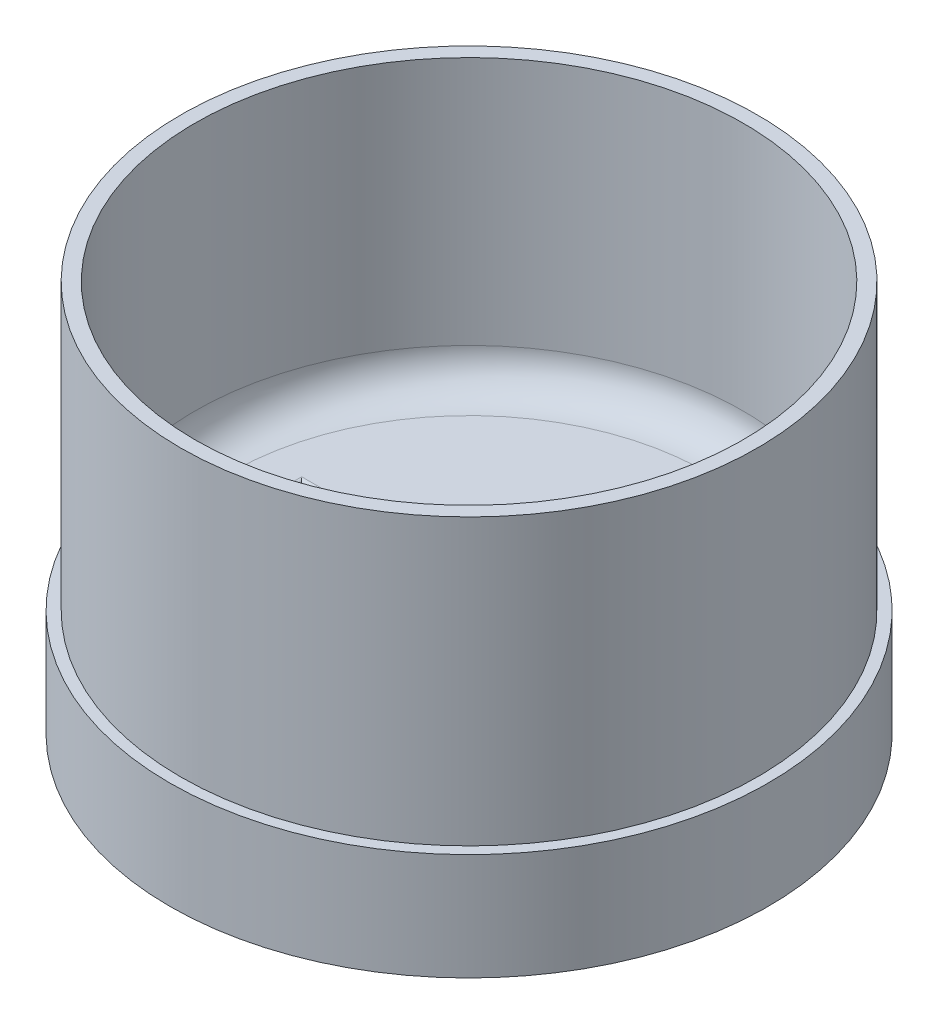
ISO-10303-21;
HEADER;
FILE_DESCRIPTION(('STEP AP214'),'2;1');
FILE_NAME('part.step','',(''),(''),'','','');
FILE_SCHEMA(('AUTOMOTIVE_DESIGN { 1 0 10303 214 1 1 1 1 }'));
ENDSEC;
DATA;
#1=APPLICATION_CONTEXT('core data for automotive mechanical design processes');
#2=APPLICATION_PROTOCOL_DEFINITION('international standard','automotive_design',2000,#1);
#3=PRODUCT_CONTEXT('',#1,'mechanical');
#4=PRODUCT('Part','Part','',(#3));
#5=PRODUCT_RELATED_PRODUCT_CATEGORY('part','',(#4));
#6=PRODUCT_DEFINITION_FORMATION('','',#4);
#7=PRODUCT_DEFINITION_CONTEXT('part definition',#1,'design');
#8=PRODUCT_DEFINITION('design','',#6,#7);
#9=PRODUCT_DEFINITION_SHAPE('','',#8);
#10=(LENGTH_UNIT() NAMED_UNIT(*) SI_UNIT(.MILLI.,.METRE.));
#11=(NAMED_UNIT(*) PLANE_ANGLE_UNIT() SI_UNIT($,.RADIAN.));
#12=(NAMED_UNIT(*) SI_UNIT($,.STERADIAN.) SOLID_ANGLE_UNIT());
#13=UNCERTAINTY_MEASURE_WITH_UNIT(LENGTH_MEASURE(1.E-05),#10,'distance_accuracy_value','');
#14=(GEOMETRIC_REPRESENTATION_CONTEXT(3) GLOBAL_UNCERTAINTY_ASSIGNED_CONTEXT((#13)) GLOBAL_UNIT_ASSIGNED_CONTEXT((#10,
#11,#12)) REPRESENTATION_CONTEXT('',''));
#15=CARTESIAN_POINT('',(0.,0.,0.));
#16=DIRECTION('',(0.,0.,1.));
#17=DIRECTION('',(1.,0.,0.));
#18=AXIS2_PLACEMENT_3D('',#15,#16,#17);
#19=CARTESIAN_POINT('',(0.,0.,0.));
#20=DIRECTION('',(0.,1.,0.));
#21=DIRECTION('',(0.,0.,1.));
#22=AXIS2_PLACEMENT_3D('',#19,#20,#21);
#23=PLANE('',#22);
#24=CARTESIAN_POINT('',(0.,0.,0.));
#25=DIRECTION('',(0.,1.,0.));
#26=DIRECTION('',(0.,0.,1.));
#27=AXIS2_PLACEMENT_3D('',#24,#25,#26);
#28=CIRCLE('',#27,84.);
#29=CARTESIAN_POINT('',(0.,0.,84.));
#30=VERTEX_POINT('',#29);
#31=EDGE_CURVE('E238',#30,#30,#28,.T.);
#32=ORIENTED_EDGE('',*,*,#31,.F.);
#33=EDGE_LOOP('',(#32));
#34=FACE_BOUND('',#33,.T.);
#35=CARTESIAN_POINT('',(0.,0.,0.));
#36=DIRECTION('',(0.,1.,0.));
#37=DIRECTION('',(0.,0.,1.));
#38=AXIS2_PLACEMENT_3D('',#35,#36,#37);
#39=CIRCLE('',#38,79.);
#40=CARTESIAN_POINT('',(0.,0.,79.));
#41=VERTEX_POINT('',#40);
#42=EDGE_CURVE('E234',#41,#41,#39,.T.);
#43=ORIENTED_EDGE('',*,*,#42,.T.);
#44=EDGE_LOOP('',(#43));
#45=FACE_BOUND('',#44,.T.);
#46=ADVANCED_FACE('F44',(#34,#45),#23,.F.);
#47=CARTESIAN_POINT('',(0.,25.,0.));
#48=DIRECTION('',(0.,-1.,0.));
#49=DIRECTION('',(0.,0.,-1.));
#50=AXIS2_PLACEMENT_3D('',#47,#48,#49);
#51=CYLINDRICAL_SURFACE('',#50,84.);
#52=ORIENTED_EDGE('',*,*,#31,.T.);
#53=EDGE_LOOP('',(#52));
#54=FACE_BOUND('',#53,.T.);
#55=CARTESIAN_POINT('',(0.,30.,0.));
#56=DIRECTION('',(0.,1.,0.));
#57=DIRECTION('',(0.,0.,1.));
#58=AXIS2_PLACEMENT_3D('',#55,#56,#57);
#59=CIRCLE('',#58,84.);
#60=CARTESIAN_POINT('',(0.,30.,84.));
#61=VERTEX_POINT('',#60);
#62=EDGE_CURVE('E227',#61,#61,#59,.T.);
#63=ORIENTED_EDGE('',*,*,#62,.F.);
#64=EDGE_LOOP('',(#63));
#65=FACE_BOUND('',#64,.T.);
#66=ADVANCED_FACE('F404',(#54,#65),#51,.T.);
#67=CARTESIAN_POINT('',(0.,25.,0.));
#68=DIRECTION('',(0.,-1.,0.));
#69=DIRECTION('',(0.,0.,-1.));
#70=AXIS2_PLACEMENT_3D('',#67,#68,#69);
#71=CYLINDRICAL_SURFACE('',#70,79.);
#72=CARTESIAN_POINT('',(0.,15.,0.));
#73=DIRECTION('',(0.,1.,0.));
#74=DIRECTION('',(0.,0.,1.));
#75=AXIS2_PLACEMENT_3D('',#72,#73,#74);
#76=CIRCLE('',#75,79.);
#77=CARTESIAN_POINT('',(0.,15.,79.));
#78=VERTEX_POINT('',#77);
#79=EDGE_CURVE('E242',#78,#78,#76,.T.);
#80=ORIENTED_EDGE('',*,*,#79,.T.);
#81=EDGE_LOOP('',(#80));
#82=FACE_BOUND('',#81,.T.);
#83=ORIENTED_EDGE('',*,*,#42,.F.);
#84=EDGE_LOOP('',(#83));
#85=FACE_BOUND('',#84,.T.);
#86=ADVANCED_FACE('F410',(#82,#85),#71,.F.);
#87=CARTESIAN_POINT('',(0.,25.,0.));
#88=DIRECTION('',(0.,1.,0.));
#89=DIRECTION('',(0.,0.,1.));
#90=AXIS2_PLACEMENT_3D('',#87,#88,#89);
#91=PLANE('',#90);
#92=DIRECTION('',(0.,0.,1.));
#93=VECTOR('',#92,1.);
#94=CARTESIAN_POINT('',(-44.,25.,0.));
#95=LINE('',#94,#93);
#96=CARTESIAN_POINT('',(-44.,25.,9.00000000000001));
#97=VERTEX_POINT('',#96);
#98=CARTESIAN_POINT('',(-44.,25.,-8.99999999999999));
#99=VERTEX_POINT('',#98);
#100=EDGE_CURVE('E293',#97,#99,#95,.F.);
#101=ORIENTED_EDGE('',*,*,#100,.T.);
#102=DIRECTION('',(1.,0.,0.));
#103=VECTOR('',#102,1.);
#104=CARTESIAN_POINT('',(0.,25.,-9.00000000000001));
#105=LINE('',#104,#103);
#106=CARTESIAN_POINT('',(-56.,25.,-8.99999999999999));
#107=VERTEX_POINT('',#106);
#108=EDGE_CURVE('E166',#99,#107,#105,.F.);
#109=ORIENTED_EDGE('',*,*,#108,.T.);
#110=DIRECTION('',(0.,0.,-1.));
#111=VECTOR('',#110,1.);
#112=CARTESIAN_POINT('',(-56.,25.,0.));
#113=LINE('',#112,#111);
#114=CARTESIAN_POINT('',(-56.,25.,9.00000000000001));
#115=VERTEX_POINT('',#114);
#116=EDGE_CURVE('E297',#107,#115,#113,.F.);
#117=ORIENTED_EDGE('',*,*,#116,.T.);
#118=DIRECTION('',(-1.,0.,0.));
#119=VECTOR('',#118,1.);
#120=CARTESIAN_POINT('',(0.,25.,9.00000000000001));
#121=LINE('',#120,#119);
#122=EDGE_CURVE('E295',#115,#97,#121,.F.);
#123=ORIENTED_EDGE('',*,*,#122,.T.);
#124=EDGE_LOOP('',(#101,#109,#117,#123));
#125=FACE_BOUND('',#124,.T.);
#126=DIRECTION('',(1.,0.,0.));
#127=VECTOR('',#126,1.);
#128=CARTESIAN_POINT('',(0.,25.,-4.5));
#129=LINE('',#128,#127);
#130=CARTESIAN_POINT('',(8.,25.,-4.5));
#131=VERTEX_POINT('',#130);
#132=CARTESIAN_POINT('',(-8.,25.,-4.5));
#133=VERTEX_POINT('',#132);
#134=EDGE_CURVE('E284',#131,#133,#129,.F.);
#135=ORIENTED_EDGE('',*,*,#134,.T.);
#136=DIRECTION('',(0.,0.,-1.));
#137=VECTOR('',#136,1.);
#138=CARTESIAN_POINT('',(-8.,25.,0.));
#139=LINE('',#138,#137);
#140=CARTESIAN_POINT('',(-8.,25.,4.5));
#141=VERTEX_POINT('',#140);
#142=EDGE_CURVE('E290',#133,#141,#139,.F.);
#143=ORIENTED_EDGE('',*,*,#142,.T.);
#144=DIRECTION('',(-1.,0.,0.));
#145=VECTOR('',#144,1.);
#146=CARTESIAN_POINT('',(0.,25.,4.5));
#147=LINE('',#146,#145);
#148=CARTESIAN_POINT('',(8.,25.,4.5));
#149=VERTEX_POINT('',#148);
#150=EDGE_CURVE('E288',#141,#149,#147,.F.);
#151=ORIENTED_EDGE('',*,*,#150,.T.);
#152=DIRECTION('',(0.,0.,1.));
#153=VECTOR('',#152,1.);
#154=CARTESIAN_POINT('',(8.,25.,0.));
#155=LINE('',#154,#153);
#156=EDGE_CURVE('E286',#149,#131,#155,.F.);
#157=ORIENTED_EDGE('',*,*,#156,.T.);
#158=EDGE_LOOP('',(#135,#143,#151,#157));
#159=FACE_BOUND('',#158,.T.);
#160=CARTESIAN_POINT('',(0.,25.,0.));
#161=DIRECTION('',(0.,1.,0.));
#162=DIRECTION('',(0.,0.,1.));
#163=AXIS2_PLACEMENT_3D('',#160,#161,#162);
#164=CIRCLE('',#163,69.);
#165=CARTESIAN_POINT('',(0.,25.,69.));
#166=VERTEX_POINT('',#165);
#167=EDGE_CURVE('E246',#166,#166,#164,.F.);
#168=ORIENTED_EDGE('',*,*,#167,.T.);
#169=EDGE_LOOP('',(#168));
#170=FACE_BOUND('',#169,.T.);
#171=ADVANCED_FACE('F401',(#125,#159,#170),#91,.F.);
#172=CARTESIAN_POINT('',(0.,30.,0.));
#173=DIRECTION('',(0.,1.,0.));
#174=DIRECTION('',(0.,0.,1.));
#175=AXIS2_PLACEMENT_3D('',#172,#173,#174);
#176=PLANE('',#175);
#177=CARTESIAN_POINT('',(0.,30.,0.));
#178=DIRECTION('',(0.,1.,0.));
#179=DIRECTION('',(0.,0.,1.));
#180=AXIS2_PLACEMENT_3D('',#177,#178,#179);
#181=CIRCLE('',#180,81.);
#182=CARTESIAN_POINT('',(0.,30.,81.));
#183=VERTEX_POINT('',#182);
#184=EDGE_CURVE('E222',#183,#183,#181,.T.);
#185=ORIENTED_EDGE('',*,*,#184,.F.);
#186=EDGE_LOOP('',(#185));
#187=FACE_BOUND('',#186,.T.);
#188=ORIENTED_EDGE('',*,*,#62,.T.);
#189=EDGE_LOOP('',(#188));
#190=FACE_BOUND('',#189,.T.);
#191=ADVANCED_FACE('F375',(#187,#190),#176,.T.);
#192=CARTESIAN_POINT('',(0.,110.,0.));
#193=DIRECTION('',(0.,1.,0.));
#194=DIRECTION('',(0.,0.,1.));
#195=AXIS2_PLACEMENT_3D('',#192,#193,#194);
#196=PLANE('',#195);
#197=CARTESIAN_POINT('',(0.,110.,0.));
#198=DIRECTION('',(0.,1.,0.));
#199=DIRECTION('',(0.,0.,1.));
#200=AXIS2_PLACEMENT_3D('',#197,#198,#199);
#201=CIRCLE('',#200,81.);
#202=CARTESIAN_POINT('',(0.,110.,81.));
#203=VERTEX_POINT('',#202);
#204=EDGE_CURVE('E223',#203,#203,#201,.T.);
#205=ORIENTED_EDGE('',*,*,#204,.T.);
#206=EDGE_LOOP('',(#205));
#207=FACE_BOUND('',#206,.T.);
#208=CARTESIAN_POINT('',(0.,110.,0.));
#209=DIRECTION('',(0.,1.,0.));
#210=DIRECTION('',(0.,0.,1.));
#211=AXIS2_PLACEMENT_3D('',#208,#209,#210);
#212=CIRCLE('',#211,77.);
#213=CARTESIAN_POINT('',(0.,110.,77.));
#214=VERTEX_POINT('',#213);
#215=EDGE_CURVE('E212',#214,#214,#212,.T.);
#216=ORIENTED_EDGE('',*,*,#215,.F.);
#217=EDGE_LOOP('',(#216));
#218=FACE_BOUND('',#217,.T.);
#219=ADVANCED_FACE('F391',(#207,#218),#196,.T.);
#220=CARTESIAN_POINT('',(0.,110.,0.));
#221=DIRECTION('',(0.,-1.,0.));
#222=DIRECTION('',(0.,0.,-1.));
#223=AXIS2_PLACEMENT_3D('',#220,#221,#222);
#224=CYLINDRICAL_SURFACE('',#223,81.);
#225=ORIENTED_EDGE('',*,*,#204,.F.);
#226=EDGE_LOOP('',(#225));
#227=FACE_BOUND('',#226,.T.);
#228=ORIENTED_EDGE('',*,*,#184,.T.);
#229=EDGE_LOOP('',(#228));
#230=FACE_BOUND('',#229,.T.);
#231=ADVANCED_FACE('F387',(#227,#230),#224,.T.);
#232=CARTESIAN_POINT('',(0.,110.,0.));
#233=DIRECTION('',(0.,-1.,0.));
#234=DIRECTION('',(0.,0.,-1.));
#235=AXIS2_PLACEMENT_3D('',#232,#233,#234);
#236=CYLINDRICAL_SURFACE('',#235,77.);
#237=CARTESIAN_POINT('',(0.,40.,0.));
#238=DIRECTION('',(0.,1.,0.));
#239=DIRECTION('',(0.,0.,1.));
#240=AXIS2_PLACEMENT_3D('',#237,#238,#239);
#241=CIRCLE('',#240,77.);
#242=CARTESIAN_POINT('',(0.,40.,77.));
#243=VERTEX_POINT('',#242);
#244=EDGE_CURVE('E250',#243,#243,#241,.F.);
#245=ORIENTED_EDGE('',*,*,#244,.T.);
#246=EDGE_LOOP('',(#245));
#247=FACE_BOUND('',#246,.T.);
#248=ORIENTED_EDGE('',*,*,#215,.T.);
#249=EDGE_LOOP('',(#248));
#250=FACE_BOUND('',#249,.T.);
#251=ADVANCED_FACE('F372',(#247,#250),#236,.F.);
#252=DIRECTION('',(0.,0.,1.));
#253=VECTOR('',#252,1.);
#254=CARTESIAN_POINT('',(-56.,30.,-7.99999999999999));
#255=LINE('',#254,#253);
#256=CARTESIAN_POINT('',(-56.,30.,9.00000000000001));
#257=VERTEX_POINT('',#256);
#258=CARTESIAN_POINT('',(-56.,30.,-8.99999999999999));
#259=VERTEX_POINT('',#258);
#260=EDGE_CURVE('E271',#257,#259,#255,.F.);
#261=ORIENTED_EDGE('',*,*,#260,.T.);
#262=DIRECTION('',(-1.,0.,0.));
#263=VECTOR('',#262,1.);
#264=CARTESIAN_POINT('',(-45.,30.,-8.99999999999999));
#265=LINE('',#264,#263);
#266=CARTESIAN_POINT('',(-44.,30.,-8.99999999999999));
#267=VERTEX_POINT('',#266);
#268=EDGE_CURVE('E273',#259,#267,#265,.F.);
#269=ORIENTED_EDGE('',*,*,#268,.T.);
#270=DIRECTION('',(0.,0.,-1.));
#271=VECTOR('',#270,1.);
#272=CARTESIAN_POINT('',(-44.,30.,8.00000000000001));
#273=LINE('',#272,#271);
#274=CARTESIAN_POINT('',(-44.,30.,9.00000000000001));
#275=VERTEX_POINT('',#274);
#276=EDGE_CURVE('E269',#267,#275,#273,.F.);
#277=ORIENTED_EDGE('',*,*,#276,.T.);
#278=DIRECTION('',(1.,0.,0.));
#279=VECTOR('',#278,1.);
#280=CARTESIAN_POINT('',(-55.,30.,9.00000000000001));
#281=LINE('',#280,#279);
#282=EDGE_CURVE('E267',#275,#257,#281,.F.);
#283=ORIENTED_EDGE('',*,*,#282,.T.);
#284=EDGE_LOOP('',(#261,#269,#277,#283));
#285=FACE_BOUND('',#284,.T.);
#286=DIRECTION('',(-1.,0.,0.));
#287=VECTOR('',#286,1.);
#288=CARTESIAN_POINT('',(-7.,30.,4.5));
#289=LINE('',#288,#287);
#290=CARTESIAN_POINT('',(8.,30.,4.5));
#291=VERTEX_POINT('',#290);
#292=CARTESIAN_POINT('',(-8.,30.,4.5));
#293=VERTEX_POINT('',#292);
#294=EDGE_CURVE('E262',#291,#293,#289,.T.);
#295=ORIENTED_EDGE('',*,*,#294,.T.);
#296=DIRECTION('',(0.,0.,-1.));
#297=VECTOR('',#296,1.);
#298=CARTESIAN_POINT('',(-8.,30.,-3.5));
#299=LINE('',#298,#297);
#300=CARTESIAN_POINT('',(-8.,30.,-4.5));
#301=VERTEX_POINT('',#300);
#302=EDGE_CURVE('E264',#293,#301,#299,.T.);
#303=ORIENTED_EDGE('',*,*,#302,.T.);
#304=DIRECTION('',(1.,0.,0.));
#305=VECTOR('',#304,1.);
#306=CARTESIAN_POINT('',(7.,30.,-4.5));
#307=LINE('',#306,#305);
#308=CARTESIAN_POINT('',(8.,30.,-4.5));
#309=VERTEX_POINT('',#308);
#310=EDGE_CURVE('E258',#301,#309,#307,.T.);
#311=ORIENTED_EDGE('',*,*,#310,.T.);
#312=DIRECTION('',(0.,0.,1.));
#313=VECTOR('',#312,1.);
#314=CARTESIAN_POINT('',(8.,30.,3.5));
#315=LINE('',#314,#313);
#316=EDGE_CURVE('E260',#309,#291,#315,.T.);
#317=ORIENTED_EDGE('',*,*,#316,.T.);
#318=EDGE_LOOP('',(#295,#303,#311,#317));
#319=FACE_BOUND('',#318,.T.);
#320=CARTESIAN_POINT('',(0.,30.,0.));
#321=DIRECTION('',(0.,1.,0.));
#322=DIRECTION('',(0.,0.,1.));
#323=AXIS2_PLACEMENT_3D('',#320,#321,#322);
#324=CIRCLE('',#323,67.);
#325=CARTESIAN_POINT('',(0.,30.,67.));
#326=VERTEX_POINT('',#325);
#327=EDGE_CURVE('E195',#326,#326,#324,.T.);
#328=ORIENTED_EDGE('',*,*,#327,.T.);
#329=EDGE_LOOP('',(#328));
#330=FACE_BOUND('',#329,.T.);
#331=ADVANCED_FACE('F368',(#285,#319,#330),#176,.T.);
#332=CARTESIAN_POINT('',(0.,15.,0.));
#333=DIRECTION('',(0.,1.,0.));
#334=DIRECTION('',(0.,0.,1.));
#335=AXIS2_PLACEMENT_3D('',#332,#333,#334);
#336=TOROIDAL_SURFACE('',#335,69.,10.);
#337=ORIENTED_EDGE('',*,*,#167,.F.);
#338=EDGE_LOOP('',(#337));
#339=FACE_BOUND('',#338,.T.);
#340=ORIENTED_EDGE('',*,*,#79,.F.);
#341=EDGE_LOOP('',(#340));
#342=FACE_BOUND('',#341,.T.);
#343=ADVANCED_FACE('F371',(#339,#342),#336,.F.);
#344=CARTESIAN_POINT('',(0.,40.,0.));
#345=DIRECTION('',(0.,1.,0.));
#346=DIRECTION('',(0.,0.,1.));
#347=AXIS2_PLACEMENT_3D('',#344,#345,#346);
#348=TOROIDAL_SURFACE('',#347,67.,10.);
#349=ORIENTED_EDGE('',*,*,#327,.F.);
#350=EDGE_LOOP('',(#349));
#351=FACE_BOUND('',#350,.T.);
#352=ORIENTED_EDGE('',*,*,#244,.F.);
#353=EDGE_LOOP('',(#352));
#354=FACE_BOUND('',#353,.T.);
#355=ADVANCED_FACE('F378',(#351,#354),#348,.F.);
#356=CARTESIAN_POINT('',(7.,110.001,3.5));
#357=DIRECTION('',(0.,0.,1.));
#358=DIRECTION('',(1.,0.,0.));
#359=AXIS2_PLACEMENT_3D('',#356,#357,#358);
#360=PLANE('',#359);
#361=DIRECTION('',(0.,-1.,0.));
#362=VECTOR('',#361,1.);
#363=CARTESIAN_POINT('',(7.,110.001,3.5));
#364=LINE('',#363,#362);
#365=CARTESIAN_POINT('',(7.,29.,3.5));
#366=VERTEX_POINT('',#365);
#367=CARTESIAN_POINT('',(7.,26.,3.5));
#368=VERTEX_POINT('',#367);
#369=EDGE_CURVE('E209',#366,#368,#364,.T.);
#370=ORIENTED_EDGE('',*,*,#369,.T.);
#371=DIRECTION('',(-1.,0.,0.));
#372=VECTOR('',#371,1.);
#373=CARTESIAN_POINT('',(7.,26.,3.5));
#374=LINE('',#373,#372);
#375=CARTESIAN_POINT('',(-7.,26.,3.5));
#376=VERTEX_POINT('',#375);
#377=EDGE_CURVE('E308',#368,#376,#374,.T.);
#378=ORIENTED_EDGE('',*,*,#377,.T.);
#379=DIRECTION('',(0.,-1.,0.));
#380=VECTOR('',#379,1.);
#381=CARTESIAN_POINT('',(-7.,110.001,3.5));
#382=LINE('',#381,#380);
#383=CARTESIAN_POINT('',(-7.,29.,3.5));
#384=VERTEX_POINT('',#383);
#385=EDGE_CURVE('E201',#384,#376,#382,.T.);
#386=ORIENTED_EDGE('',*,*,#385,.F.);
#387=DIRECTION('',(-1.,0.,0.));
#388=VECTOR('',#387,1.);
#389=CARTESIAN_POINT('',(7.,29.,3.5));
#390=LINE('',#389,#388);
#391=EDGE_CURVE('E306',#384,#366,#390,.F.);
#392=ORIENTED_EDGE('',*,*,#391,.T.);
#393=EDGE_LOOP('',(#370,#378,#386,#392));
#394=FACE_BOUND('',#393,.T.);
#395=ADVANCED_FACE('F381',(#394),#360,.F.);
#396=CARTESIAN_POINT('',(7.,110.001,-3.5));
#397=DIRECTION('',(1.,0.,0.));
#398=DIRECTION('',(0.,0.,-1.));
#399=AXIS2_PLACEMENT_3D('',#396,#397,#398);
#400=PLANE('',#399);
#401=DIRECTION('',(0.,-1.,0.));
#402=VECTOR('',#401,1.);
#403=CARTESIAN_POINT('',(7.,110.001,-3.5));
#404=LINE('',#403,#402);
#405=CARTESIAN_POINT('',(7.,29.,-3.5));
#406=VERTEX_POINT('',#405);
#407=CARTESIAN_POINT('',(7.,26.,-3.5));
#408=VERTEX_POINT('',#407);
#409=EDGE_CURVE('E213',#406,#408,#404,.T.);
#410=ORIENTED_EDGE('',*,*,#409,.T.);
#411=DIRECTION('',(0.,0.,1.));
#412=VECTOR('',#411,1.);
#413=CARTESIAN_POINT('',(7.,26.,-3.5));
#414=LINE('',#413,#412);
#415=EDGE_CURVE('E311',#408,#368,#414,.T.);
#416=ORIENTED_EDGE('',*,*,#415,.T.);
#417=ORIENTED_EDGE('',*,*,#369,.F.);
#418=DIRECTION('',(0.,0.,1.));
#419=VECTOR('',#418,1.);
#420=CARTESIAN_POINT('',(7.,29.,-3.5));
#421=LINE('',#420,#419);
#422=EDGE_CURVE('E66',#366,#406,#421,.F.);
#423=ORIENTED_EDGE('',*,*,#422,.T.);
#424=EDGE_LOOP('',(#410,#416,#417,#423));
#425=FACE_BOUND('',#424,.T.);
#426=ADVANCED_FACE('F562',(#425),#400,.F.);
#427=CARTESIAN_POINT('',(-7.,110.001,-3.5));
#428=DIRECTION('',(0.,0.,-1.));
#429=DIRECTION('',(-1.,0.,0.));
#430=AXIS2_PLACEMENT_3D('',#427,#428,#429);
#431=PLANE('',#430);
#432=DIRECTION('',(0.,-1.,0.));
#433=VECTOR('',#432,1.);
#434=CARTESIAN_POINT('',(-7.,110.001,-3.5));
#435=LINE('',#434,#433);
#436=CARTESIAN_POINT('',(-7.,29.,-3.5));
#437=VERTEX_POINT('',#436);
#438=CARTESIAN_POINT('',(-7.,26.,-3.5));
#439=VERTEX_POINT('',#438);
#440=EDGE_CURVE('E215',#437,#439,#435,.T.);
#441=ORIENTED_EDGE('',*,*,#440,.T.);
#442=DIRECTION('',(1.,0.,0.));
#443=VECTOR('',#442,1.);
#444=CARTESIAN_POINT('',(-7.,26.,-3.5));
#445=LINE('',#444,#443);
#446=EDGE_CURVE('E11',#439,#408,#445,.T.);
#447=ORIENTED_EDGE('',*,*,#446,.T.);
#448=ORIENTED_EDGE('',*,*,#409,.F.);
#449=DIRECTION('',(1.,0.,0.));
#450=VECTOR('',#449,1.);
#451=CARTESIAN_POINT('',(-7.,29.,-3.5));
#452=LINE('',#451,#450);
#453=EDGE_CURVE('E53',#406,#437,#452,.F.);
#454=ORIENTED_EDGE('',*,*,#453,.T.);
#455=EDGE_LOOP('',(#441,#447,#448,#454));
#456=FACE_BOUND('',#455,.T.);
#457=ADVANCED_FACE('F358',(#456),#431,.F.);
#458=CARTESIAN_POINT('',(-7.,110.001,3.5));
#459=DIRECTION('',(-1.,0.,0.));
#460=DIRECTION('',(0.,0.,1.));
#461=AXIS2_PLACEMENT_3D('',#458,#459,#460);
#462=PLANE('',#461);
#463=ORIENTED_EDGE('',*,*,#385,.T.);
#464=DIRECTION('',(0.,0.,-1.));
#465=VECTOR('',#464,1.);
#466=CARTESIAN_POINT('',(-7.,26.,3.5));
#467=LINE('',#466,#465);
#468=EDGE_CURVE('E303',#376,#439,#467,.T.);
#469=ORIENTED_EDGE('',*,*,#468,.T.);
#470=ORIENTED_EDGE('',*,*,#440,.F.);
#471=DIRECTION('',(0.,0.,-1.));
#472=VECTOR('',#471,1.);
#473=CARTESIAN_POINT('',(-7.,29.,3.5));
#474=LINE('',#473,#472);
#475=EDGE_CURVE('E300',#437,#384,#474,.F.);
#476=ORIENTED_EDGE('',*,*,#475,.T.);
#477=EDGE_LOOP('',(#463,#469,#470,#476));
#478=FACE_BOUND('',#477,.T.);
#479=ADVANCED_FACE('F361',(#478),#462,.F.);
#480=CARTESIAN_POINT('',(-55.,-0.001000000000001,-7.99999999999999));
#481=DIRECTION('',(-1.,0.,0.));
#482=DIRECTION('',(0.,0.,1.));
#483=AXIS2_PLACEMENT_3D('',#480,#481,#482);
#484=PLANE('',#483);
#485=DIRECTION('',(0.,1.,0.));
#486=VECTOR('',#485,1.);
#487=CARTESIAN_POINT('',(-55.,-0.001000000000001,-7.99999999999999));
#488=LINE('',#487,#486);
#489=CARTESIAN_POINT('',(-55.,26.,-7.99999999999999));
#490=VERTEX_POINT('',#489);
#491=CARTESIAN_POINT('',(-55.,29.,-7.99999999999999));
#492=VERTEX_POINT('',#491);
#493=EDGE_CURVE('E192',#490,#492,#488,.T.);
#494=ORIENTED_EDGE('',*,*,#493,.T.);
#495=DIRECTION('',(0.,0.,1.));
#496=VECTOR('',#495,1.);
#497=CARTESIAN_POINT('',(-55.,29.,8.00000000000001));
#498=LINE('',#497,#496);
#499=CARTESIAN_POINT('',(-55.,29.,8.00000000000001));
#500=VERTEX_POINT('',#499);
#501=EDGE_CURVE('E182',#492,#500,#498,.T.);
#502=ORIENTED_EDGE('',*,*,#501,.T.);
#503=DIRECTION('',(0.,1.,0.));
#504=VECTOR('',#503,1.);
#505=CARTESIAN_POINT('',(-55.,-0.001000000000001,8.00000000000001));
#506=LINE('',#505,#504);
#507=CARTESIAN_POINT('',(-55.,26.,8.00000000000001));
#508=VERTEX_POINT('',#507);
#509=EDGE_CURVE('E203',#508,#500,#506,.T.);
#510=ORIENTED_EDGE('',*,*,#509,.F.);
#511=DIRECTION('',(0.,0.,-1.));
#512=VECTOR('',#511,1.);
#513=CARTESIAN_POINT('',(-55.,26.,-7.99999999999999));
#514=LINE('',#513,#512);
#515=EDGE_CURVE('E276',#508,#490,#514,.T.);
#516=ORIENTED_EDGE('',*,*,#515,.T.);
#517=EDGE_LOOP('',(#494,#502,#510,#516));
#518=FACE_BOUND('',#517,.T.);
#519=ADVANCED_FACE('F542',(#518),#484,.F.);
#520=CARTESIAN_POINT('',(-45.,-0.001000000000001,-7.99999999999999));
#521=DIRECTION('',(0.,0.,-1.));
#522=DIRECTION('',(-1.,0.,0.));
#523=AXIS2_PLACEMENT_3D('',#520,#521,#522);
#524=PLANE('',#523);
#525=DIRECTION('',(0.,1.,0.));
#526=VECTOR('',#525,1.);
#527=CARTESIAN_POINT('',(-45.,-0.001000000000001,-7.99999999999999));
#528=LINE('',#527,#526);
#529=CARTESIAN_POINT('',(-45.,26.,-7.99999999999999));
#530=VERTEX_POINT('',#529);
#531=CARTESIAN_POINT('',(-45.,29.,-7.99999999999999));
#532=VERTEX_POINT('',#531);
#533=EDGE_CURVE('E189',#530,#532,#528,.T.);
#534=ORIENTED_EDGE('',*,*,#533,.T.);
#535=DIRECTION('',(-1.,0.,0.));
#536=VECTOR('',#535,1.);
#537=CARTESIAN_POINT('',(-55.,29.,-7.99999999999999));
#538=LINE('',#537,#536);
#539=EDGE_CURVE('E194',#532,#492,#538,.T.);
#540=ORIENTED_EDGE('',*,*,#539,.T.);
#541=ORIENTED_EDGE('',*,*,#493,.F.);
#542=DIRECTION('',(1.,0.,0.));
#543=VECTOR('',#542,1.);
#544=CARTESIAN_POINT('',(-45.,26.,-7.99999999999999));
#545=LINE('',#544,#543);
#546=EDGE_CURVE('E164',#490,#530,#545,.T.);
#547=ORIENTED_EDGE('',*,*,#546,.T.);
#548=EDGE_LOOP('',(#534,#540,#541,#547));
#549=FACE_BOUND('',#548,.T.);
#550=ADVANCED_FACE('F187',(#549),#524,.F.);
#551=CARTESIAN_POINT('',(-45.,-0.001000000000001,8.00000000000001));
#552=DIRECTION('',(1.,0.,0.));
#553=DIRECTION('',(0.,0.,-1.));
#554=AXIS2_PLACEMENT_3D('',#551,#552,#553);
#555=PLANE('',#554);
#556=DIRECTION('',(0.,1.,0.));
#557=VECTOR('',#556,1.);
#558=CARTESIAN_POINT('',(-45.,-0.001000000000001,8.00000000000001));
#559=LINE('',#558,#557);
#560=CARTESIAN_POINT('',(-45.,26.,8.00000000000001));
#561=VERTEX_POINT('',#560);
#562=CARTESIAN_POINT('',(-45.,29.,8.00000000000001));
#563=VERTEX_POINT('',#562);
#564=EDGE_CURVE('E199',#561,#563,#559,.T.);
#565=ORIENTED_EDGE('',*,*,#564,.T.);
#566=DIRECTION('',(0.,0.,-1.));
#567=VECTOR('',#566,1.);
#568=CARTESIAN_POINT('',(-45.,29.,-7.99999999999999));
#569=LINE('',#568,#567);
#570=EDGE_CURVE('E181',#563,#532,#569,.T.);
#571=ORIENTED_EDGE('',*,*,#570,.T.);
#572=ORIENTED_EDGE('',*,*,#533,.F.);
#573=DIRECTION('',(0.,0.,1.));
#574=VECTOR('',#573,1.);
#575=CARTESIAN_POINT('',(-45.,26.,8.00000000000001));
#576=LINE('',#575,#574);
#577=EDGE_CURVE('E173',#530,#561,#576,.T.);
#578=ORIENTED_EDGE('',*,*,#577,.T.);
#579=EDGE_LOOP('',(#565,#571,#572,#578));
#580=FACE_BOUND('',#579,.T.);
#581=ADVANCED_FACE('F197',(#580),#555,.F.);
#582=CARTESIAN_POINT('',(-55.,-0.001000000000001,8.00000000000001));
#583=DIRECTION('',(0.,0.,1.));
#584=DIRECTION('',(1.,0.,0.));
#585=AXIS2_PLACEMENT_3D('',#582,#583,#584);
#586=PLANE('',#585);
#587=ORIENTED_EDGE('',*,*,#509,.T.);
#588=DIRECTION('',(1.,0.,0.));
#589=VECTOR('',#588,1.);
#590=CARTESIAN_POINT('',(-45.,29.,8.00000000000001));
#591=LINE('',#590,#589);
#592=EDGE_CURVE('E282',#500,#563,#591,.T.);
#593=ORIENTED_EDGE('',*,*,#592,.T.);
#594=ORIENTED_EDGE('',*,*,#564,.F.);
#595=DIRECTION('',(-1.,0.,0.));
#596=VECTOR('',#595,1.);
#597=CARTESIAN_POINT('',(-55.,26.,8.00000000000001));
#598=LINE('',#597,#596);
#599=EDGE_CURVE('E280',#561,#508,#598,.T.);
#600=ORIENTED_EDGE('',*,*,#599,.T.);
#601=EDGE_LOOP('',(#587,#593,#594,#600));
#602=FACE_BOUND('',#601,.T.);
#603=ADVANCED_FACE('F437',(#602),#586,.F.);
#604=CARTESIAN_POINT('',(-55.,29.,9.00000000000001));
#605=DIRECTION('',(-1.,0.,0.));
#606=DIRECTION('',(0.,0.,1.));
#607=AXIS2_PLACEMENT_3D('',#604,#605,#606);
#608=CYLINDRICAL_SURFACE('',#607,1.);
#609=CARTESIAN_POINT('',(-56.,29.,9.00000000000001));
#610=DIRECTION('',(-0.707106781186547,0.,-0.707106781186547));
#611=DIRECTION('',(0.707106781186547,0.,-0.707106781186547));
#612=AXIS2_PLACEMENT_3D('',#609,#610,#611);
#613=ELLIPSE('',#612,1.41421356237309,1.);
#614=EDGE_CURVE('E319',#257,#500,#613,.T.);
#615=ORIENTED_EDGE('',*,*,#614,.F.);
#616=ORIENTED_EDGE('',*,*,#282,.F.);
#617=CARTESIAN_POINT('',(-44.,29.,9.00000000000001));
#618=DIRECTION('',(-0.707106781186547,0.,0.707106781186547));
#619=DIRECTION('',(0.707106781186547,0.,0.707106781186547));
#620=AXIS2_PLACEMENT_3D('',#617,#618,#619);
#621=ELLIPSE('',#620,1.41421356237309,1.);
#622=EDGE_CURVE('E208',#563,#275,#621,.F.);
#623=ORIENTED_EDGE('',*,*,#622,.F.);
#624=ORIENTED_EDGE('',*,*,#592,.F.);
#625=EDGE_LOOP('',(#615,#616,#623,#624));
#626=FACE_BOUND('',#625,.T.);
#627=ADVANCED_FACE('F433',(#626),#608,.T.);
#628=CARTESIAN_POINT('',(-44.,29.,8.00000000000001));
#629=DIRECTION('',(0.,0.,1.));
#630=DIRECTION('',(1.,0.,0.));
#631=AXIS2_PLACEMENT_3D('',#628,#629,#630);
#632=CYLINDRICAL_SURFACE('',#631,1.);
#633=ORIENTED_EDGE('',*,*,#622,.T.);
#634=ORIENTED_EDGE('',*,*,#276,.F.);
#635=CARTESIAN_POINT('',(-44.,29.,-8.99999999999999));
#636=DIRECTION('',(0.707106781186548,0.,0.707106781186547));
#637=DIRECTION('',(0.707106781186547,0.,-0.707106781186548));
#638=AXIS2_PLACEMENT_3D('',#635,#636,#637);
#639=ELLIPSE('',#638,1.4142135623731,1.);
#640=EDGE_CURVE('E316',#532,#267,#639,.F.);
#641=ORIENTED_EDGE('',*,*,#640,.F.);
#642=ORIENTED_EDGE('',*,*,#570,.F.);
#643=EDGE_LOOP('',(#633,#634,#641,#642));
#644=FACE_BOUND('',#643,.T.);
#645=ADVANCED_FACE('F429',(#644),#632,.T.);
#646=CARTESIAN_POINT('',(-56.,29.,-7.99999999999999));
#647=DIRECTION('',(0.,0.,-1.));
#648=DIRECTION('',(-1.,0.,0.));
#649=AXIS2_PLACEMENT_3D('',#646,#647,#648);
#650=CYLINDRICAL_SURFACE('',#649,1.);
#651=ORIENTED_EDGE('',*,*,#614,.T.);
#652=ORIENTED_EDGE('',*,*,#501,.F.);
#653=CARTESIAN_POINT('',(-56.,29.,-8.99999999999999));
#654=DIRECTION('',(0.707106781186547,0.,-0.707106781186548));
#655=DIRECTION('',(0.707106781186548,0.,0.707106781186547));
#656=AXIS2_PLACEMENT_3D('',#653,#654,#655);
#657=ELLIPSE('',#656,1.41421356237309,1.);
#658=EDGE_CURVE('E314',#259,#492,#657,.T.);
#659=ORIENTED_EDGE('',*,*,#658,.F.);
#660=ORIENTED_EDGE('',*,*,#260,.F.);
#661=EDGE_LOOP('',(#651,#652,#659,#660));
#662=FACE_BOUND('',#661,.T.);
#663=ADVANCED_FACE('F425',(#662),#650,.T.);
#664=CARTESIAN_POINT('',(-45.,29.,-8.99999999999999));
#665=DIRECTION('',(1.,0.,0.));
#666=DIRECTION('',(0.,0.,-1.));
#667=AXIS2_PLACEMENT_3D('',#664,#665,#666);
#668=CYLINDRICAL_SURFACE('',#667,1.);
#669=ORIENTED_EDGE('',*,*,#640,.T.);
#670=ORIENTED_EDGE('',*,*,#268,.F.);
#671=ORIENTED_EDGE('',*,*,#658,.T.);
#672=ORIENTED_EDGE('',*,*,#539,.F.);
#673=EDGE_LOOP('',(#669,#670,#671,#672));
#674=FACE_BOUND('',#673,.T.);
#675=ADVANCED_FACE('F421',(#674),#668,.T.);
#676=CARTESIAN_POINT('',(-55.,26.,9.00000000000001));
#677=DIRECTION('',(-1.,0.,0.));
#678=DIRECTION('',(0.,0.,1.));
#679=AXIS2_PLACEMENT_3D('',#676,#677,#678);
#680=CYLINDRICAL_SURFACE('',#679,1.);
#681=CARTESIAN_POINT('',(-44.,26.,9.00000000000001));
#682=DIRECTION('',(-0.707106781186547,0.,0.707106781186547));
#683=DIRECTION('',(-0.707106781186547,0.,-0.707106781186547));
#684=AXIS2_PLACEMENT_3D('',#681,#682,#683);
#685=ELLIPSE('',#684,1.41421356237309,1.);
#686=EDGE_CURVE('E176',#97,#561,#685,.F.);
#687=ORIENTED_EDGE('',*,*,#686,.F.);
#688=ORIENTED_EDGE('',*,*,#122,.F.);
#689=CARTESIAN_POINT('',(-56.,26.,9.00000000000001));
#690=DIRECTION('',(-0.707106781186547,0.,-0.707106781186547));
#691=DIRECTION('',(0.707106781186547,0.,-0.707106781186547));
#692=AXIS2_PLACEMENT_3D('',#689,#690,#691);
#693=ELLIPSE('',#692,1.41421356237309,1.);
#694=EDGE_CURVE('E317',#508,#115,#693,.T.);
#695=ORIENTED_EDGE('',*,*,#694,.F.);
#696=ORIENTED_EDGE('',*,*,#599,.F.);
#697=EDGE_LOOP('',(#687,#688,#695,#696));
#698=FACE_BOUND('',#697,.T.);
#699=ADVANCED_FACE('F424',(#698),#680,.T.);
#700=CARTESIAN_POINT('',(-56.,26.,-7.99999999999999));
#701=DIRECTION('',(0.,0.,-1.));
#702=DIRECTION('',(-1.,0.,0.));
#703=AXIS2_PLACEMENT_3D('',#700,#701,#702);
#704=CYLINDRICAL_SURFACE('',#703,1.);
#705=ORIENTED_EDGE('',*,*,#694,.T.);
#706=ORIENTED_EDGE('',*,*,#116,.F.);
#707=CARTESIAN_POINT('',(-56.,26.,-8.99999999999999));
#708=DIRECTION('',(0.707106781186547,0.,-0.707106781186548));
#709=DIRECTION('',(0.707106781186548,0.,0.707106781186547));
#710=AXIS2_PLACEMENT_3D('',#707,#708,#709);
#711=ELLIPSE('',#710,1.41421356237309,1.);
#712=EDGE_CURVE('E169',#490,#107,#711,.T.);
#713=ORIENTED_EDGE('',*,*,#712,.F.);
#714=ORIENTED_EDGE('',*,*,#515,.F.);
#715=EDGE_LOOP('',(#705,#706,#713,#714));
#716=FACE_BOUND('',#715,.T.);
#717=ADVANCED_FACE('F444',(#716),#704,.T.);
#718=CARTESIAN_POINT('',(-44.,26.,8.00000000000001));
#719=DIRECTION('',(0.,0.,1.));
#720=DIRECTION('',(1.,0.,0.));
#721=AXIS2_PLACEMENT_3D('',#718,#719,#720);
#722=CYLINDRICAL_SURFACE('',#721,1.);
#723=ORIENTED_EDGE('',*,*,#686,.T.);
#724=ORIENTED_EDGE('',*,*,#577,.F.);
#725=CARTESIAN_POINT('',(-44.,26.,-8.99999999999999));
#726=DIRECTION('',(0.707106781186548,0.,0.707106781186547));
#727=DIRECTION('',(0.707106781186547,0.,-0.707106781186548));
#728=AXIS2_PLACEMENT_3D('',#725,#726,#727);
#729=ELLIPSE('',#728,1.4142135623731,1.);
#730=EDGE_CURVE('E160',#99,#530,#729,.F.);
#731=ORIENTED_EDGE('',*,*,#730,.F.);
#732=ORIENTED_EDGE('',*,*,#100,.F.);
#733=EDGE_LOOP('',(#723,#724,#731,#732));
#734=FACE_BOUND('',#733,.T.);
#735=ADVANCED_FACE('F174',(#734),#722,.T.);
#736=CARTESIAN_POINT('',(-45.,26.,-8.99999999999999));
#737=DIRECTION('',(1.,0.,0.));
#738=DIRECTION('',(0.,0.,-1.));
#739=AXIS2_PLACEMENT_3D('',#736,#737,#738);
#740=CYLINDRICAL_SURFACE('',#739,1.);
#741=ORIENTED_EDGE('',*,*,#712,.T.);
#742=ORIENTED_EDGE('',*,*,#108,.F.);
#743=ORIENTED_EDGE('',*,*,#730,.T.);
#744=ORIENTED_EDGE('',*,*,#546,.F.);
#745=EDGE_LOOP('',(#741,#742,#743,#744));
#746=FACE_BOUND('',#745,.T.);
#747=ADVANCED_FACE('F162',(#746),#740,.T.);
#748=CARTESIAN_POINT('',(8.,26.,-3.5));
#749=DIRECTION('',(0.,0.,1.));
#750=DIRECTION('',(1.,0.,0.));
#751=AXIS2_PLACEMENT_3D('',#748,#749,#750);
#752=CYLINDRICAL_SURFACE('',#751,1.);
#753=CARTESIAN_POINT('',(8.,26.,-4.5));
#754=DIRECTION('',(0.707106781186547,0.,0.707106781186548));
#755=DIRECTION('',(-0.707106781186548,0.,0.707106781186547));
#756=AXIS2_PLACEMENT_3D('',#753,#754,#755);
#757=ELLIPSE('',#756,1.4142135623731,1.);
#758=EDGE_CURVE('E332',#131,#408,#757,.F.);
#759=ORIENTED_EDGE('',*,*,#758,.F.);
#760=ORIENTED_EDGE('',*,*,#156,.F.);
#761=CARTESIAN_POINT('',(8.,26.,4.5));
#762=DIRECTION('',(-0.707106781186548,0.,0.707106781186547));
#763=DIRECTION('',(-0.707106781186547,0.,-0.707106781186548));
#764=AXIS2_PLACEMENT_3D('',#761,#762,#763);
#765=ELLIPSE('',#764,1.41421356237309,1.);
#766=EDGE_CURVE('E170',#368,#149,#765,.T.);
#767=ORIENTED_EDGE('',*,*,#766,.F.);
#768=ORIENTED_EDGE('',*,*,#415,.F.);
#769=EDGE_LOOP('',(#759,#760,#767,#768));
#770=FACE_BOUND('',#769,.T.);
#771=ADVANCED_FACE('F441',(#770),#752,.T.);
#772=CARTESIAN_POINT('',(7.,26.,4.5));
#773=DIRECTION('',(-1.,0.,0.));
#774=DIRECTION('',(0.,0.,1.));
#775=AXIS2_PLACEMENT_3D('',#772,#773,#774);
#776=CYLINDRICAL_SURFACE('',#775,1.);
#777=ORIENTED_EDGE('',*,*,#766,.T.);
#778=ORIENTED_EDGE('',*,*,#150,.F.);
#779=CARTESIAN_POINT('',(-8.,26.,4.5));
#780=DIRECTION('',(-0.707106781186547,0.,-0.707106781186547));
#781=DIRECTION('',(0.707106781186547,0.,-0.707106781186547));
#782=AXIS2_PLACEMENT_3D('',#779,#780,#781);
#783=ELLIPSE('',#782,1.41421356237309,1.);
#784=EDGE_CURVE('E330',#376,#141,#783,.T.);
#785=ORIENTED_EDGE('',*,*,#784,.F.);
#786=ORIENTED_EDGE('',*,*,#377,.F.);
#787=EDGE_LOOP('',(#777,#778,#785,#786));
#788=FACE_BOUND('',#787,.T.);
#789=ADVANCED_FACE('F458',(#788),#776,.T.);
#790=CARTESIAN_POINT('',(-7.,26.,-4.5));
#791=DIRECTION('',(1.,0.,0.));
#792=DIRECTION('',(0.,0.,-1.));
#793=AXIS2_PLACEMENT_3D('',#790,#791,#792);
#794=CYLINDRICAL_SURFACE('',#793,1.);
#795=ORIENTED_EDGE('',*,*,#758,.T.);
#796=ORIENTED_EDGE('',*,*,#446,.F.);
#797=CARTESIAN_POINT('',(-8.,26.,-4.5));
#798=DIRECTION('',(0.707106781186547,0.,-0.707106781186547));
#799=DIRECTION('',(-0.707106781186547,0.,-0.707106781186547));
#800=AXIS2_PLACEMENT_3D('',#797,#798,#799);
#801=ELLIPSE('',#800,1.41421356237309,1.);
#802=EDGE_CURVE('E328',#133,#439,#801,.F.);
#803=ORIENTED_EDGE('',*,*,#802,.F.);
#804=ORIENTED_EDGE('',*,*,#134,.F.);
#805=EDGE_LOOP('',(#795,#796,#803,#804));
#806=FACE_BOUND('',#805,.T.);
#807=ADVANCED_FACE('F454',(#806),#794,.T.);
#808=CARTESIAN_POINT('',(-8.,26.,3.5));
#809=DIRECTION('',(0.,0.,-1.));
#810=DIRECTION('',(-1.,0.,0.));
#811=AXIS2_PLACEMENT_3D('',#808,#809,#810);
#812=CYLINDRICAL_SURFACE('',#811,1.);
#813=ORIENTED_EDGE('',*,*,#784,.T.);
#814=ORIENTED_EDGE('',*,*,#142,.F.);
#815=ORIENTED_EDGE('',*,*,#802,.T.);
#816=ORIENTED_EDGE('',*,*,#468,.F.);
#817=EDGE_LOOP('',(#813,#814,#815,#816));
#818=FACE_BOUND('',#817,.T.);
#819=ADVANCED_FACE('F451',(#818),#812,.T.);
#820=CARTESIAN_POINT('',(8.,29.,0.));
#821=DIRECTION('',(0.,0.,-1.));
#822=DIRECTION('',(-1.,0.,0.));
#823=AXIS2_PLACEMENT_3D('',#820,#821,#822);
#824=CYLINDRICAL_SURFACE('',#823,1.);
#825=CARTESIAN_POINT('',(8.,29.,-4.5));
#826=DIRECTION('',(-0.707106781186547,0.,-0.707106781186548));
#827=DIRECTION('',(0.707106781186548,0.,-0.707106781186547));
#828=AXIS2_PLACEMENT_3D('',#825,#826,#827);
#829=ELLIPSE('',#828,1.4142135623731,1.);
#830=EDGE_CURVE('E340',#406,#309,#829,.T.);
#831=ORIENTED_EDGE('',*,*,#830,.F.);
#832=ORIENTED_EDGE('',*,*,#422,.F.);
#833=CARTESIAN_POINT('',(8.,29.,4.5));
#834=DIRECTION('',(0.707106781186548,0.,-0.707106781186547));
#835=DIRECTION('',(0.707106781186547,0.,0.707106781186548));
#836=AXIS2_PLACEMENT_3D('',#833,#834,#835);
#837=ELLIPSE('',#836,1.41421356237309,1.);
#838=EDGE_CURVE('E48',#291,#366,#837,.F.);
#839=ORIENTED_EDGE('',*,*,#838,.F.);
#840=ORIENTED_EDGE('',*,*,#316,.F.);
#841=EDGE_LOOP('',(#831,#832,#839,#840));
#842=FACE_BOUND('',#841,.T.);
#843=ADVANCED_FACE('F46',(#842),#824,.T.);
#844=CARTESIAN_POINT('',(0.,29.,4.5));
#845=DIRECTION('',(1.,0.,0.));
#846=DIRECTION('',(0.,0.,-1.));
#847=AXIS2_PLACEMENT_3D('',#844,#845,#846);
#848=CYLINDRICAL_SURFACE('',#847,1.);
#849=ORIENTED_EDGE('',*,*,#838,.T.);
#850=ORIENTED_EDGE('',*,*,#391,.F.);
#851=CARTESIAN_POINT('',(-8.,29.,4.5));
#852=DIRECTION('',(0.707106781186547,0.,0.707106781186547));
#853=DIRECTION('',(-0.707106781186547,0.,0.707106781186547));
#854=AXIS2_PLACEMENT_3D('',#851,#852,#853);
#855=ELLIPSE('',#854,1.41421356237309,1.);
#856=EDGE_CURVE('E339',#293,#384,#855,.F.);
#857=ORIENTED_EDGE('',*,*,#856,.F.);
#858=ORIENTED_EDGE('',*,*,#294,.F.);
#859=EDGE_LOOP('',(#849,#850,#857,#858));
#860=FACE_BOUND('',#859,.T.);
#861=ADVANCED_FACE('F351',(#860),#848,.T.);
#862=CARTESIAN_POINT('',(0.,29.,-4.5));
#863=DIRECTION('',(-1.,0.,0.));
#864=DIRECTION('',(0.,0.,1.));
#865=AXIS2_PLACEMENT_3D('',#862,#863,#864);
#866=CYLINDRICAL_SURFACE('',#865,1.);
#867=ORIENTED_EDGE('',*,*,#830,.T.);
#868=ORIENTED_EDGE('',*,*,#310,.F.);
#869=CARTESIAN_POINT('',(-8.,29.,-4.5));
#870=DIRECTION('',(-0.707106781186547,0.,0.707106781186547));
#871=DIRECTION('',(0.707106781186547,0.,0.707106781186547));
#872=AXIS2_PLACEMENT_3D('',#869,#870,#871);
#873=ELLIPSE('',#872,1.41421356237309,1.);
#874=EDGE_CURVE('E337',#437,#301,#873,.T.);
#875=ORIENTED_EDGE('',*,*,#874,.F.);
#876=ORIENTED_EDGE('',*,*,#453,.F.);
#877=EDGE_LOOP('',(#867,#868,#875,#876));
#878=FACE_BOUND('',#877,.T.);
#879=ADVANCED_FACE('F356',(#878),#866,.T.);
#880=CARTESIAN_POINT('',(-8.,29.,0.));
#881=DIRECTION('',(0.,0.,1.));
#882=DIRECTION('',(1.,0.,0.));
#883=AXIS2_PLACEMENT_3D('',#880,#881,#882);
#884=CYLINDRICAL_SURFACE('',#883,1.);
#885=ORIENTED_EDGE('',*,*,#856,.T.);
#886=ORIENTED_EDGE('',*,*,#475,.F.);
#887=ORIENTED_EDGE('',*,*,#874,.T.);
#888=ORIENTED_EDGE('',*,*,#302,.F.);
#889=EDGE_LOOP('',(#885,#886,#887,#888));
#890=FACE_BOUND('',#889,.T.);
#891=ADVANCED_FACE('F365',(#890),#884,.T.);
#892=CLOSED_SHELL('',(#46,#66,#86,#171,#191,#219,#231,#251,#331,#343,#355,#395,#426,#457,#479,
#519,#550,#581,#603,#627,#645,#663,#675,#699,#717,#735,#747,#771,#789,#807,#819,#843,#861,#879,#891));
#893=MANIFOLD_SOLID_BREP('B2',#892);
#894=ADVANCED_BREP_SHAPE_REPRESENTATION('',(#18,#893),#14);
#895=SHAPE_DEFINITION_REPRESENTATION(#9,#894);
ENDSEC;
END-ISO-10303-21;
